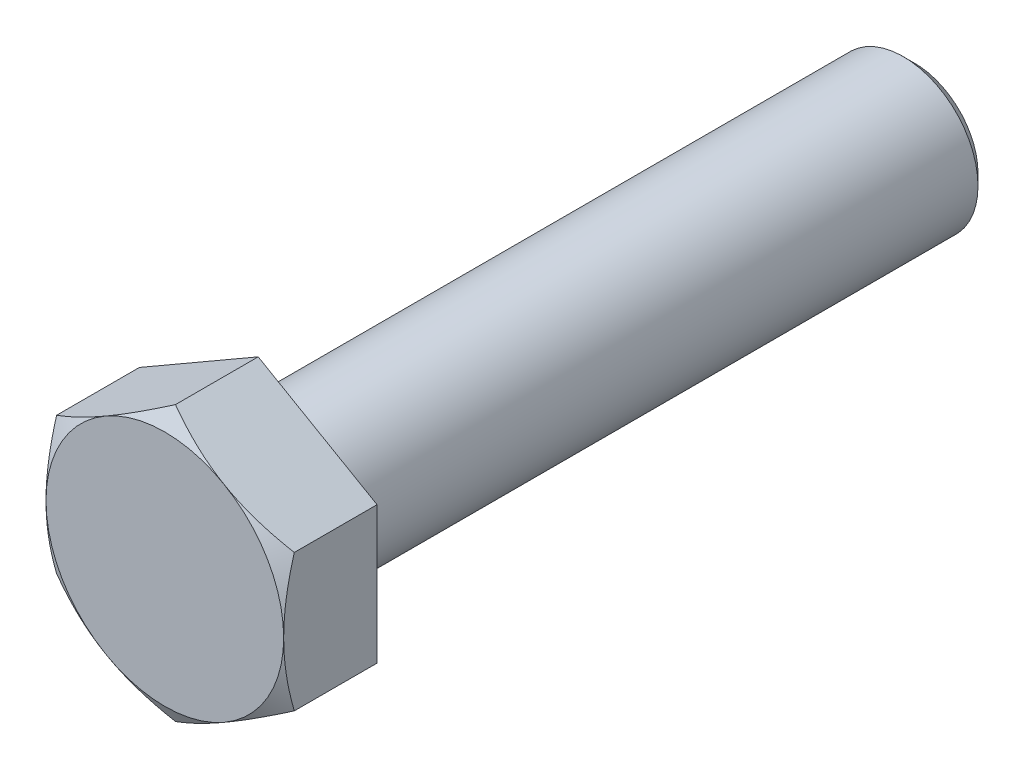
ISO-10303-21;
HEADER;
FILE_DESCRIPTION(('STEP AP214'),'2;1');
FILE_NAME('part.step','',(''),(''),'','','');
FILE_SCHEMA(('AUTOMOTIVE_DESIGN { 1 0 10303 214 1 1 1 1 }'));
ENDSEC;
DATA;
#1=APPLICATION_CONTEXT('core data for automotive mechanical design processes');
#2=APPLICATION_PROTOCOL_DEFINITION('international standard','automotive_design',2000,#1);
#3=PRODUCT_CONTEXT('',#1,'mechanical');
#4=PRODUCT('Part','Part','',(#3));
#5=PRODUCT_RELATED_PRODUCT_CATEGORY('part','',(#4));
#6=PRODUCT_DEFINITION_FORMATION('','',#4);
#7=PRODUCT_DEFINITION_CONTEXT('part definition',#1,'design');
#8=PRODUCT_DEFINITION('design','',#6,#7);
#9=PRODUCT_DEFINITION_SHAPE('','',#8);
#10=(LENGTH_UNIT() NAMED_UNIT(*) SI_UNIT(.MILLI.,.METRE.));
#11=(NAMED_UNIT(*) PLANE_ANGLE_UNIT() SI_UNIT($,.RADIAN.));
#12=(NAMED_UNIT(*) SI_UNIT($,.STERADIAN.) SOLID_ANGLE_UNIT());
#13=UNCERTAINTY_MEASURE_WITH_UNIT(LENGTH_MEASURE(1.E-05),#10,'distance_accuracy_value','');
#14=(GEOMETRIC_REPRESENTATION_CONTEXT(3) GLOBAL_UNCERTAINTY_ASSIGNED_CONTEXT((#13)) GLOBAL_UNIT_ASSIGNED_CONTEXT((#10,
#11,#12)) REPRESENTATION_CONTEXT('',''));
#15=CARTESIAN_POINT('',(0.,0.,0.));
#16=DIRECTION('',(0.,0.,1.));
#17=DIRECTION('',(1.,0.,0.));
#18=AXIS2_PLACEMENT_3D('',#15,#16,#17);
#19=CARTESIAN_POINT('',(0.,0.,0.));
#20=DIRECTION('',(0.,0.,1.));
#21=DIRECTION('',(1.,0.,0.));
#22=AXIS2_PLACEMENT_3D('',#19,#20,#21);
#23=PLANE('',#22);
#24=CARTESIAN_POINT('',(0.,0.,0.));
#25=DIRECTION('',(0.,0.,1.));
#26=DIRECTION('',(1.,0.,0.));
#27=AXIS2_PLACEMENT_3D('',#24,#25,#26);
#28=CIRCLE('',#27,4.6);
#29=CARTESIAN_POINT('',(4.6,0.,0.));
#30=VERTEX_POINT('',#29);
#31=EDGE_CURVE('E148',#30,#30,#28,.T.);
#32=ORIENTED_EDGE('',*,*,#31,.T.);
#33=EDGE_LOOP('',(#32));
#34=FACE_BOUND('',#33,.T.);
#35=CARTESIAN_POINT('',(0.,0.,0.));
#36=DIRECTION('',(0.,0.,1.));
#37=DIRECTION('',(1.,0.,0.));
#38=AXIS2_PLACEMENT_3D('',#35,#36,#37);
#39=CIRCLE('',#38,5.8);
#40=CARTESIAN_POINT('',(5.8,0.,0.));
#41=VERTEX_POINT('',#40);
#42=EDGE_CURVE('E294',#41,#41,#39,.T.);
#43=ORIENTED_EDGE('',*,*,#42,.F.);
#44=EDGE_LOOP('',(#43));
#45=FACE_BOUND('',#44,.T.);
#46=ADVANCED_FACE('F39',(#34,#45),#23,.F.);
#47=CARTESIAN_POINT('',(0.,0.,-0.6));
#48=DIRECTION('',(0.,0.,1.));
#49=DIRECTION('',(1.,0.,0.));
#50=AXIS2_PLACEMENT_3D('',#47,#48,#49);
#51=TOROIDAL_SURFACE('',#50,4.6,0.600000000000001);
#52=ORIENTED_EDGE('',*,*,#31,.F.);
#53=EDGE_LOOP('',(#52));
#54=FACE_BOUND('',#53,.T.);
#55=CARTESIAN_POINT('',(0.,0.,-0.6));
#56=DIRECTION('',(0.,0.,1.));
#57=DIRECTION('',(1.,0.,0.));
#58=AXIS2_PLACEMENT_3D('',#55,#56,#57);
#59=CIRCLE('',#58,4.);
#60=CARTESIAN_POINT('',(4.,0.,-0.6));
#61=VERTEX_POINT('',#60);
#62=EDGE_CURVE('E151',#61,#61,#59,.T.);
#63=ORIENTED_EDGE('',*,*,#62,.T.);
#64=EDGE_LOOP('',(#63));
#65=FACE_BOUND('',#64,.T.);
#66=ADVANCED_FACE('F235',(#54,#65),#51,.F.);
#67=CARTESIAN_POINT('',(0.,0.,0.));
#68=DIRECTION('',(0.,0.,1.));
#69=DIRECTION('',(1.,0.,0.));
#70=AXIS2_PLACEMENT_3D('',#67,#68,#69);
#71=CYLINDRICAL_SURFACE('',#70,4.);
#72=ORIENTED_EDGE('',*,*,#62,.F.);
#73=EDGE_LOOP('',(#72));
#74=FACE_BOUND('',#73,.T.);
#75=CARTESIAN_POINT('',(0.,0.,-34.4));
#76=DIRECTION('',(0.,0.,1.));
#77=DIRECTION('',(1.,0.,0.));
#78=AXIS2_PLACEMENT_3D('',#75,#76,#77);
#79=CIRCLE('',#78,4.);
#80=CARTESIAN_POINT('',(4.,0.,-34.4));
#81=VERTEX_POINT('',#80);
#82=EDGE_CURVE('E154',#81,#81,#79,.T.);
#83=ORIENTED_EDGE('',*,*,#82,.T.);
#84=EDGE_LOOP('',(#83));
#85=FACE_BOUND('',#84,.T.);
#86=ADVANCED_FACE('F241',(#74,#85),#71,.T.);
#87=CARTESIAN_POINT('',(0.,0.,-35.));
#88=DIRECTION('',(0.,0.,1.));
#89=DIRECTION('',(1.,0.,0.));
#90=AXIS2_PLACEMENT_3D('',#87,#88,#89);
#91=CONICAL_SURFACE('',#90,3.4,0.785398163397446);
#92=ORIENTED_EDGE('',*,*,#82,.F.);
#93=EDGE_LOOP('',(#92));
#94=FACE_BOUND('',#93,.T.);
#95=CARTESIAN_POINT('',(0.,0.,-35.));
#96=DIRECTION('',(0.,0.,1.));
#97=DIRECTION('',(1.,0.,0.));
#98=AXIS2_PLACEMENT_3D('',#95,#96,#97);
#99=CIRCLE('',#98,3.4);
#100=CARTESIAN_POINT('',(3.4,0.,-35.));
#101=VERTEX_POINT('',#100);
#102=EDGE_CURVE('E127',#101,#101,#99,.T.);
#103=ORIENTED_EDGE('',*,*,#102,.T.);
#104=EDGE_LOOP('',(#103));
#105=FACE_BOUND('',#104,.T.);
#106=ADVANCED_FACE('F308',(#94,#105),#91,.T.);
#107=CARTESIAN_POINT('',(0.,3.4,-35.));
#108=DIRECTION('',(0.,0.,1.));
#109=DIRECTION('',(1.,0.,0.));
#110=AXIS2_PLACEMENT_3D('',#107,#108,#109);
#111=PLANE('',#110);
#112=ORIENTED_EDGE('',*,*,#102,.F.);
#113=EDGE_LOOP('',(#112));
#114=FACE_BOUND('',#113,.T.);
#115=ADVANCED_FACE('F304',(#114),#111,.F.);
#116=CARTESIAN_POINT('',(0.,7.34966892678394,0.150000000000001));
#117=DIRECTION('',(0.,0.,-1.));
#118=DIRECTION('',(-1.,0.,0.));
#119=AXIS2_PLACEMENT_3D('',#116,#117,#118);
#120=PLANE('',#119);
#121=CARTESIAN_POINT('',(0.,0.,0.150000000000001));
#122=DIRECTION('',(0.,0.,1.));
#123=DIRECTION('',(1.,0.,0.));
#124=AXIS2_PLACEMENT_3D('',#121,#122,#123);
#125=CIRCLE('',#124,5.88660254037844);
#126=CARTESIAN_POINT('',(5.88660254037844,0.,0.150000000000001));
#127=VERTEX_POINT('',#126);
#128=EDGE_CURVE('E291',#127,#127,#125,.T.);
#129=ORIENTED_EDGE('',*,*,#128,.T.);
#130=EDGE_LOOP('',(#129));
#131=FACE_BOUND('',#130,.T.);
#132=DIRECTION('',(0.866025403784439,-0.5,0.));
#133=VECTOR('',#132,1.);
#134=CARTESIAN_POINT('',(6.365,3.67483446339197,0.150000000000001));
#135=LINE('',#134,#133);
#136=CARTESIAN_POINT('',(0.,7.34966892678394,0.150000000000001));
#137=VERTEX_POINT('',#136);
#138=CARTESIAN_POINT('',(6.365,3.67483446339197,0.150000000000003));
#139=VERTEX_POINT('',#138);
#140=EDGE_CURVE('E62',#137,#139,#135,.T.);
#141=ORIENTED_EDGE('',*,*,#140,.T.);
#142=DIRECTION('',(0.,-1.,0.));
#143=VECTOR('',#142,1.);
#144=CARTESIAN_POINT('',(6.365,-3.67483446339197,0.150000000000001));
#145=LINE('',#144,#143);
#146=CARTESIAN_POINT('',(6.365,-3.67483446339197,0.150000000000001));
#147=VERTEX_POINT('',#146);
#148=EDGE_CURVE('E11',#139,#147,#145,.T.);
#149=ORIENTED_EDGE('',*,*,#148,.T.);
#150=DIRECTION('',(-0.866025403784439,-0.5,0.));
#151=VECTOR('',#150,1.);
#152=CARTESIAN_POINT('',(0.,-7.34966892678394,0.150000000000001));
#153=LINE('',#152,#151);
#154=CARTESIAN_POINT('',(0.,-7.34966892678394,0.150000000000001));
#155=VERTEX_POINT('',#154);
#156=EDGE_CURVE('E162',#147,#155,#153,.T.);
#157=ORIENTED_EDGE('',*,*,#156,.T.);
#158=DIRECTION('',(-0.866025403784438,0.5,0.));
#159=VECTOR('',#158,1.);
#160=CARTESIAN_POINT('',(-6.365,-3.67483446339197,0.150000000000001));
#161=LINE('',#160,#159);
#162=CARTESIAN_POINT('',(-6.365,-3.67483446339197,0.150000000000001));
#163=VERTEX_POINT('',#162);
#164=EDGE_CURVE('E160',#155,#163,#161,.T.);
#165=ORIENTED_EDGE('',*,*,#164,.T.);
#166=DIRECTION('',(0.,1.,0.));
#167=VECTOR('',#166,1.);
#168=CARTESIAN_POINT('',(-6.365,3.67483446339197,0.150000000000001));
#169=LINE('',#168,#167);
#170=CARTESIAN_POINT('',(-6.365,3.67483446339197,0.150000000000001));
#171=VERTEX_POINT('',#170);
#172=EDGE_CURVE('E113',#163,#171,#169,.T.);
#173=ORIENTED_EDGE('',*,*,#172,.T.);
#174=DIRECTION('',(0.866025403784439,0.5,0.));
#175=VECTOR('',#174,1.);
#176=CARTESIAN_POINT('',(0.,7.34966892678394,0.150000000000001));
#177=LINE('',#176,#175);
#178=EDGE_CURVE('E110',#171,#137,#177,.T.);
#179=ORIENTED_EDGE('',*,*,#178,.T.);
#180=EDGE_LOOP('',(#141,#149,#157,#165,#173,#179));
#181=FACE_BOUND('',#180,.T.);
#182=ADVANCED_FACE('F111',(#131,#181),#120,.T.);
#183=CARTESIAN_POINT('',(0.,0.,0.150000000000001));
#184=DIRECTION('',(0.,0.,1.));
#185=DIRECTION('',(1.,0.,0.));
#186=AXIS2_PLACEMENT_3D('',#183,#184,#185);
#187=CONICAL_SURFACE('',#186,5.88660254037844,0.523598775598302);
#188=ORIENTED_EDGE('',*,*,#42,.T.);
#189=EDGE_LOOP('',(#188));
#190=FACE_BOUND('',#189,.T.);
#191=ORIENTED_EDGE('',*,*,#128,.F.);
#192=EDGE_LOOP('',(#191));
#193=FACE_BOUND('',#192,.T.);
#194=ADVANCED_FACE('F186',(#190,#193),#187,.T.);
#195=CARTESIAN_POINT('',(6.365,-3.67483446339197,5.15));
#196=DIRECTION('',(-1.,0.,0.));
#197=DIRECTION('',(0.,0.,1.));
#198=AXIS2_PLACEMENT_3D('',#195,#196,#197);
#199=PLANE('',#198);
#200=CARTESIAN_POINT('',(6.365,-9.74620255402201,2.10417752070094));
#201=CARTESIAN_POINT('',(6.365,-9.466743061924,2.23922778450705));
#202=CARTESIAN_POINT('',(6.365,-9.18662283336427,2.37293553637398));
#203=CARTESIAN_POINT('',(6.365,-8.62470364838083,2.63689885997667));
#204=CARTESIAN_POINT('',(6.365,-8.34290441151386,2.76715383400583));
#205=CARTESIAN_POINT('',(6.365,-7.77574769826275,3.02413063602513));
#206=CARTESIAN_POINT('',(6.365,-7.49037908790233,3.15082797964364));
#207=CARTESIAN_POINT('',(6.365,-6.91729637209056,3.39878070466244));
#208=CARTESIAN_POINT('',(6.365,-6.62958238982508,3.52003636972724));
#209=CARTESIAN_POINT('',(6.365,-6.04777966328442,3.75709828240193));
#210=CARTESIAN_POINT('',(6.365,-5.75365602159666,3.87281935215871));
#211=CARTESIAN_POINT('',(6.365,-5.16193930006325,4.09519817931673));
#212=CARTESIAN_POINT('',(6.365,-4.864345838395,4.20185492835972));
#213=CARTESIAN_POINT('',(6.365,-4.26582830474239,4.40323957299992));
#214=CARTESIAN_POINT('',(6.365,-3.96491285237291,4.49799282927845));
#215=CARTESIAN_POINT('',(6.365,-3.35880092538506,4.67249210660028));
#216=CARTESIAN_POINT('',(6.365,-3.05360583750632,4.75224287346636));
#217=CARTESIAN_POINT('',(6.365,-2.43874088628671,4.89286958916527));
#218=CARTESIAN_POINT('',(6.365,-2.12906985440494,4.95374051233359));
#219=CARTESIAN_POINT('',(6.365,-1.50595084883236,5.05249385747353));
#220=CARTESIAN_POINT('',(6.365,-1.19250287180248,5.0903762591204));
#221=CARTESIAN_POINT('',(6.365,-0.721832091587364,5.12753002038573));
#222=CARTESIAN_POINT('',(6.365,-0.565346043942451,5.13663818585123));
#223=CARTESIAN_POINT('',(6.365,-0.252121475645645,5.14822358924696));
#224=CARTESIAN_POINT('',(6.365,-0.0953829582988819,5.15070091328813));
#225=CARTESIAN_POINT('',(6.365,0.218011475278279,5.14895808707227));
#226=CARTESIAN_POINT('',(6.365,0.374667402345121,5.14473981644265));
#227=CARTESIAN_POINT('',(6.365,0.687665429465812,5.12971270573269));
#228=CARTESIAN_POINT('',(6.365,0.844007513456339,5.11890353652779));
#229=CARTESIAN_POINT('',(6.365,1.22293245370947,5.08494297431608));
#230=CARTESIAN_POINT('',(6.365,1.445224118384,5.05848904503914));
#231=CARTESIAN_POINT('',(6.365,1.88810410746324,4.99372467120738));
#232=CARTESIAN_POINT('',(6.365,2.10869195007896,4.95541099043317));
#233=CARTESIAN_POINT('',(6.365,2.547982235728,4.86828591240334));
#234=CARTESIAN_POINT('',(6.365,2.76668269133519,4.81946458949066));
#235=CARTESIAN_POINT('',(6.365,3.20183348991462,4.71281384098773));
#236=CARTESIAN_POINT('',(6.365,3.4182840428113,4.65498526400403));
#237=CARTESIAN_POINT('',(6.365,3.85426615972079,4.53019185361869));
#238=CARTESIAN_POINT('',(6.365,4.07374319251582,4.46303781689891));
#239=CARTESIAN_POINT('',(6.365,4.51037738064171,4.32209453671705));
#240=CARTESIAN_POINT('',(6.365,4.72753602208682,4.24830986982301));
#241=CARTESIAN_POINT('',(6.365,5.15866204869267,4.09562942366593));
#242=CARTESIAN_POINT('',(6.365,5.37264051637927,4.01676475081889));
#243=CARTESIAN_POINT('',(6.365,5.79893727559048,3.85440649793558));
#244=CARTESIAN_POINT('',(6.365,6.01125485600018,3.77091104705295));
#245=CARTESIAN_POINT('',(6.365,6.22280111012558,3.68555829334041));
#246=B_SPLINE_CURVE_WITH_KNOTS('',3,(#200,#201,#202,#203,#204,#205,#206,#207,#208,#209,#210,
#211,#212,#213,#214,#215,#216,#217,#218,#219,#220,#221,#222,#223,#224,#225,#226,#227,#228,#229,
#230,#231,#232,#233,#234,#235,#236,#237,#238,#239,#240,#241,#242,#243,#244,#245),.UNSPECIFIED.,
.F.,.F.,(4,2,2,2,2,2,2,2,2,2,2,2,2,2,2,2,2,2,2,2,2,2,4),(0.,0.931154614866976,1.86246938194105,
2.79911368730425,3.73570911030725,4.68380301837242,5.63200225923999,6.57814578450031,
7.52398950564165,8.47008478721693,9.41618090525813,9.88631422449017,10.3564414383406,
10.8264366986048,11.2964554305782,11.9676621628092,12.6390522116941,13.3110792699478,
13.9830430523123,14.6714781192221,15.3594416141426,16.0435327883289,16.7279023793783),.UNSPECIFIED.);
#247=CARTESIAN_POINT('',(6.365,-3.67483446339197,4.58150113005864));
#248=VERTEX_POINT('',#247);
#249=CARTESIAN_POINT('',(6.365,0.,5.15));
#250=VERTEX_POINT('',#249);
#251=EDGE_CURVE('E289',#248,#250,#246,.T.);
#252=ORIENTED_EDGE('',*,*,#251,.F.);
#253=DIRECTION('',(0.,0.,-1.));
#254=VECTOR('',#253,1.);
#255=CARTESIAN_POINT('',(6.365,-3.67483446339197,5.15));
#256=LINE('',#255,#254);
#257=EDGE_CURVE('E144',#248,#147,#256,.T.);
#258=ORIENTED_EDGE('',*,*,#257,.T.);
#259=ORIENTED_EDGE('',*,*,#148,.F.);
#260=DIRECTION('',(0.,0.,-1.));
#261=VECTOR('',#260,1.);
#262=CARTESIAN_POINT('',(6.365,3.67483446339197,5.15));
#263=LINE('',#262,#261);
#264=CARTESIAN_POINT('',(6.365,3.67483446339197,4.58150113005864));
#265=VERTEX_POINT('',#264);
#266=EDGE_CURVE('E126',#265,#139,#263,.T.);
#267=ORIENTED_EDGE('',*,*,#266,.F.);
#268=EDGE_CURVE('E191',#250,#265,#246,.T.);
#269=ORIENTED_EDGE('',*,*,#268,.F.);
#270=EDGE_LOOP('',(#252,#258,#259,#267,#269));
#271=FACE_BOUND('',#270,.T.);
#272=ADVANCED_FACE('F246',(#271),#199,.F.);
#273=CARTESIAN_POINT('',(0.,-7.34966892678394,5.15));
#274=DIRECTION('',(-0.5,0.866025403784439,0.));
#275=DIRECTION('',(-0.866025403784439,-0.5,0.));
#276=AXIS2_PLACEMENT_3D('',#273,#274,#275);
#277=PLANE('',#276);
#278=CARTESIAN_POINT('',(-0.000200000000001205,-7.34978439683778,4.58143446182091));
#279=CARTESIAN_POINT('',(0.139710039115643,-7.26900729809203,4.6280643413956));
#280=CARTESIAN_POINT('',(0.280141730709852,-7.18792902314736,4.67257800061253));
#281=CARTESIAN_POINT('',(0.562145571657772,-7.02511402966357,4.75679002639063));
#282=CARTESIAN_POINT('',(0.703718185116129,-6.94337704317351,4.79648631569877));
#283=CARTESIAN_POINT('',(1.13070279037378,-6.69685736638818,4.90756995845888));
#284=CARTESIAN_POINT('',(1.41780023937635,-6.53110157692289,4.97075318530501));
#285=CARTESIAN_POINT('',(1.84743635075536,-6.28305105236463,5.04484317711931));
#286=CARTESIAN_POINT('',(1.9886912977997,-6.20149747066421,5.0659493132145));
#287=CARTESIAN_POINT('',(2.27183945542866,-6.03802180563659,5.10134132834389));
#288=CARTESIAN_POINT('',(2.41373260850058,-5.95609975551435,5.11562780998361));
#289=CARTESIAN_POINT('',(2.6977653589495,-5.792113370584,5.13701642089907));
#290=CARTESIAN_POINT('',(2.83990449241902,-5.71004930361299,5.1441267036469));
#291=CARTESIAN_POINT('',(3.12430622079744,-5.54584988917571,5.15101808099618));
#292=CARTESIAN_POINT('',(3.26656881175663,-5.46371454398981,5.15079940200902));
#293=CARTESIAN_POINT('',(3.65632359139324,-5.23868951704867,5.14012613527418));
#294=CARTESIAN_POINT('',(3.90368820112705,-5.09587349303087,5.1222078418454));
#295=CARTESIAN_POINT('',(4.39677444253791,-4.81119001881861,5.06538838058255));
#296=CARTESIAN_POINT('',(4.64249434006573,-4.66932356983568,5.02646779156689));
#297=CARTESIAN_POINT('',(5.13657294389504,-4.38406715491399,4.92917745645478));
#298=CARTESIAN_POINT('',(5.38486930573046,-4.24071318356951,4.87039549497283));
#299=CARTESIAN_POINT('',(5.87775919646686,-3.956143072472,4.73698409890944));
#300=CARTESIAN_POINT('',(6.12235903782157,-3.81492328822212,4.66238600278679));
#301=CARTESIAN_POINT('',(6.3652,-3.67471899333814,4.58143446182091));
#302=B_SPLINE_CURVE_WITH_KNOTS('',3,(#278,#279,#280,#281,#282,#283,#284,#285,#286,#287,#288,
#289,#290,#291,#292,#293,#294,#295,#296,#297,#298,#299,#300,#301),.UNSPECIFIED.,.F.,.F.,(4,2,2,
2,2,2,2,2,2,2,2,4),(0.,0.504406880784759,1.00903049509045,2.02037460639605,2.51366063649745,
3.00690307026488,3.49958445754648,3.99225062458519,4.84993121388198,5.70840627760013,
6.58592135712847,7.46171369114761),.UNSPECIFIED.);
#303=CARTESIAN_POINT('',(0.,-7.34966892678394,4.58150113005864));
#304=VERTEX_POINT('',#303);
#305=CARTESIAN_POINT('',(3.1825,-5.51225169508795,5.15));
#306=VERTEX_POINT('',#305);
#307=EDGE_CURVE('E260',#304,#306,#302,.T.);
#308=ORIENTED_EDGE('',*,*,#307,.F.);
#309=DIRECTION('',(0.,0.,-1.));
#310=VECTOR('',#309,1.);
#311=CARTESIAN_POINT('',(0.,-7.34966892678394,5.15));
#312=LINE('',#311,#310);
#313=EDGE_CURVE('E141',#304,#155,#312,.T.);
#314=ORIENTED_EDGE('',*,*,#313,.T.);
#315=ORIENTED_EDGE('',*,*,#156,.F.);
#316=ORIENTED_EDGE('',*,*,#257,.F.);
#317=EDGE_CURVE('E201',#306,#248,#302,.T.);
#318=ORIENTED_EDGE('',*,*,#317,.F.);
#319=EDGE_LOOP('',(#308,#314,#315,#316,#318));
#320=FACE_BOUND('',#319,.T.);
#321=ADVANCED_FACE('F249',(#320),#277,.F.);
#322=CARTESIAN_POINT('',(-6.365,-3.67483446339197,5.15));
#323=DIRECTION('',(0.5,0.866025403784439,0.));
#324=DIRECTION('',(-0.866025403784438,0.5,0.));
#325=AXIS2_PLACEMENT_3D('',#322,#323,#324);
#326=PLANE('',#325);
#327=CARTESIAN_POINT('',(-6.3652,-3.67471899333813,4.58143446182091));
#328=CARTESIAN_POINT('',(-6.22528996088436,-3.75549609208388,4.6280643413956));
#329=CARTESIAN_POINT('',(-6.08485826929015,-3.83657436702855,4.67257800061253));
#330=CARTESIAN_POINT('',(-5.80285442834223,-3.99938936051234,4.75679002639063));
#331=CARTESIAN_POINT('',(-5.66128181488387,-4.0811263470024,4.79648631569877));
#332=CARTESIAN_POINT('',(-5.23429720962622,-4.32764602378773,4.90756995845888));
#333=CARTESIAN_POINT('',(-4.94719976062365,-4.49340181325302,4.97075318530501));
#334=CARTESIAN_POINT('',(-4.51756364924464,-4.74145233781128,5.04484317711931));
#335=CARTESIAN_POINT('',(-4.3763087022003,-4.82300591951169,5.0659493132145));
#336=CARTESIAN_POINT('',(-4.09316054457134,-4.98648158453932,5.10134132834389));
#337=CARTESIAN_POINT('',(-3.95126739149942,-5.06840363466156,5.11562780998361));
#338=CARTESIAN_POINT('',(-3.6672346410505,-5.23239001959191,5.13701642089907));
#339=CARTESIAN_POINT('',(-3.52509550758098,-5.31445408656292,5.1441267036469));
#340=CARTESIAN_POINT('',(-3.24069377920256,-5.47865350100019,5.15101808099618));
#341=CARTESIAN_POINT('',(-3.09843118824337,-5.5607888461861,5.15079940200902));
#342=CARTESIAN_POINT('',(-2.70867640860676,-5.78581387312724,5.14012613527418));
#343=CARTESIAN_POINT('',(-2.46131179887295,-5.92862989714504,5.1222078418454));
#344=CARTESIAN_POINT('',(-1.96822555746209,-6.2133133713573,5.06538838058255));
#345=CARTESIAN_POINT('',(-1.72250565993427,-6.35517982034023,5.02646779156689));
#346=CARTESIAN_POINT('',(-1.22842705610496,-6.64043623526192,4.92917745645478));
#347=CARTESIAN_POINT('',(-0.980130694269542,-6.78379020660641,4.87039549497283));
#348=CARTESIAN_POINT('',(-0.487240803533137,-7.06836031770391,4.73698409890944));
#349=CARTESIAN_POINT('',(-0.242640962178432,-7.20958010195379,4.66238600278679));
#350=CARTESIAN_POINT('',(0.000199999999998262,-7.34978439683778,4.58143446182091));
#351=B_SPLINE_CURVE_WITH_KNOTS('',3,(#327,#328,#329,#330,#331,#332,#333,#334,#335,#336,#337,
#338,#339,#340,#341,#342,#343,#344,#345,#346,#347,#348,#349,#350),.UNSPECIFIED.,.F.,.F.,(4,2,2,
2,2,2,2,2,2,2,2,4),(0.,0.504406880784758,1.00903049509045,2.02037460639605,2.51366063649744,
3.00690307026488,3.49958445754648,3.99225062458519,4.84993121388198,5.70840627760013,
6.58592135712847,7.46171369114762),.UNSPECIFIED.);
#352=CARTESIAN_POINT('',(-6.365,-3.67483446339197,4.58150113005864));
#353=VERTEX_POINT('',#352);
#354=CARTESIAN_POINT('',(-3.1825,-5.51225169508795,5.15));
#355=VERTEX_POINT('',#354);
#356=EDGE_CURVE('E222',#353,#355,#351,.T.);
#357=ORIENTED_EDGE('',*,*,#356,.F.);
#358=DIRECTION('',(0.,0.,-1.));
#359=VECTOR('',#358,1.);
#360=CARTESIAN_POINT('',(-6.365,-3.67483446339197,5.15));
#361=LINE('',#360,#359);
#362=EDGE_CURVE('E136',#353,#163,#361,.T.);
#363=ORIENTED_EDGE('',*,*,#362,.T.);
#364=ORIENTED_EDGE('',*,*,#164,.F.);
#365=ORIENTED_EDGE('',*,*,#313,.F.);
#366=EDGE_CURVE('E209',#355,#304,#351,.T.);
#367=ORIENTED_EDGE('',*,*,#366,.F.);
#368=EDGE_LOOP('',(#357,#363,#364,#365,#367));
#369=FACE_BOUND('',#368,.T.);
#370=ADVANCED_FACE('F226',(#369),#326,.F.);
#371=CARTESIAN_POINT('',(-6.365,3.67483446339197,5.15));
#372=DIRECTION('',(1.,0.,0.));
#373=DIRECTION('',(0.,0.,-1.));
#374=AXIS2_PLACEMENT_3D('',#371,#372,#373);
#375=PLANE('',#374);
#376=CARTESIAN_POINT('',(-6.365,-9.74620255402201,2.10417752070094));
#377=CARTESIAN_POINT('',(-6.365,-9.466743061924,2.23922778450705));
#378=CARTESIAN_POINT('',(-6.365,-9.18662283336426,2.37293553637398));
#379=CARTESIAN_POINT('',(-6.365,-8.62470364838082,2.63689885997667));
#380=CARTESIAN_POINT('',(-6.365,-8.34290441151386,2.76715383400583));
#381=CARTESIAN_POINT('',(-6.365,-7.77574769826275,3.02413063602514));
#382=CARTESIAN_POINT('',(-6.365,-7.49037908790233,3.15082797964364));
#383=CARTESIAN_POINT('',(-6.365,-6.91729637209055,3.39878070466244));
#384=CARTESIAN_POINT('',(-6.365,-6.62958238982508,3.52003636972724));
#385=CARTESIAN_POINT('',(-6.365,-6.04777966328442,3.75709828240193));
#386=CARTESIAN_POINT('',(-6.365,-5.75365602159666,3.87281935215871));
#387=CARTESIAN_POINT('',(-6.365,-5.16193930006325,4.09519817931673));
#388=CARTESIAN_POINT('',(-6.365,-4.864345838395,4.20185492835972));
#389=CARTESIAN_POINT('',(-6.365,-4.26582830474239,4.40323957299992));
#390=CARTESIAN_POINT('',(-6.365,-3.96491285237291,4.49799282927845));
#391=CARTESIAN_POINT('',(-6.365,-3.35880092538506,4.67249210660028));
#392=CARTESIAN_POINT('',(-6.365,-3.05360583750632,4.75224287346636));
#393=CARTESIAN_POINT('',(-6.365,-2.4387408862867,4.89286958916527));
#394=CARTESIAN_POINT('',(-6.365,-2.12906985440494,4.95374051233359));
#395=CARTESIAN_POINT('',(-6.365,-1.50595084883235,5.05249385747353));
#396=CARTESIAN_POINT('',(-6.365,-1.19250287180248,5.0903762591204));
#397=CARTESIAN_POINT('',(-6.365,-0.72183209158736,5.12753002038573));
#398=CARTESIAN_POINT('',(-6.365,-0.565346043942447,5.13663818585123));
#399=CARTESIAN_POINT('',(-6.365,-0.252121475645641,5.14822358924696));
#400=CARTESIAN_POINT('',(-6.365,-0.0953829582988774,5.15070091328813));
#401=CARTESIAN_POINT('',(-6.365,0.218011475278284,5.14895808707227));
#402=CARTESIAN_POINT('',(-6.365,0.374667402345125,5.14473981644265));
#403=CARTESIAN_POINT('',(-6.365,0.687665429465816,5.12971270573269));
#404=CARTESIAN_POINT('',(-6.365,0.844007513456343,5.11890353652778));
#405=CARTESIAN_POINT('',(-6.365,1.22293245370947,5.08494297431608));
#406=CARTESIAN_POINT('',(-6.365,1.445224118384,5.05848904503914));
#407=CARTESIAN_POINT('',(-6.365,1.88810410746324,4.99372467120738));
#408=CARTESIAN_POINT('',(-6.365,2.10869195007897,4.95541099043317));
#409=CARTESIAN_POINT('',(-6.365,2.547982235728,4.86828591240333));
#410=CARTESIAN_POINT('',(-6.365,2.76668269133519,4.81946458949066));
#411=CARTESIAN_POINT('',(-6.365,3.20183348991463,4.71281384098773));
#412=CARTESIAN_POINT('',(-6.365,3.4182840428113,4.65498526400403));
#413=CARTESIAN_POINT('',(-6.365,3.85426615972079,4.53019185361869));
#414=CARTESIAN_POINT('',(-6.365,4.07374319251583,4.46303781689891));
#415=CARTESIAN_POINT('',(-6.365,4.51037738064171,4.32209453671705));
#416=CARTESIAN_POINT('',(-6.365,4.72753602208683,4.24830986982301));
#417=CARTESIAN_POINT('',(-6.365,5.15866204869268,4.09562942366593));
#418=CARTESIAN_POINT('',(-6.365,5.37264051637928,4.01676475081889));
#419=CARTESIAN_POINT('',(-6.365,5.79893727559049,3.85440649793558));
#420=CARTESIAN_POINT('',(-6.365,6.01125485600019,3.77091104705294));
#421=CARTESIAN_POINT('',(-6.365,6.22280111012559,3.6855582933404));
#422=B_SPLINE_CURVE_WITH_KNOTS('',3,(#376,#377,#378,#379,#380,#381,#382,#383,#384,#385,#386,
#387,#388,#389,#390,#391,#392,#393,#394,#395,#396,#397,#398,#399,#400,#401,#402,#403,#404,#405,
#406,#407,#408,#409,#410,#411,#412,#413,#414,#415,#416,#417,#418,#419,#420,#421),.UNSPECIFIED.,
.F.,.F.,(4,2,2,2,2,2,2,2,2,2,2,2,2,2,2,2,2,2,2,2,2,2,4),(0.,0.931154614866975,1.86246938194105,
2.79911368730425,3.73570911030724,4.68380301837242,5.63200225923999,6.57814578450031,
7.52398950564165,8.47008478721693,9.41618090525813,9.88631422449017,10.3564414383406,
10.8264366986048,11.2964554305782,11.9676621628092,12.6390522116941,13.3110792699478,
13.9830430523123,14.6714781192221,15.3594416141426,16.0435327883289,16.7279023793783),.UNSPECIFIED.);
#423=CARTESIAN_POINT('',(-6.365,3.67483446339197,4.58150113005864));
#424=VERTEX_POINT('',#423);
#425=CARTESIAN_POINT('',(-6.365,0.,5.15));
#426=VERTEX_POINT('',#425);
#427=EDGE_CURVE('E221',#424,#426,#422,.F.);
#428=ORIENTED_EDGE('',*,*,#427,.F.);
#429=DIRECTION('',(0.,0.,-1.));
#430=VECTOR('',#429,1.);
#431=CARTESIAN_POINT('',(-6.365,3.67483446339197,5.15));
#432=LINE('',#431,#430);
#433=EDGE_CURVE('E133',#424,#171,#432,.T.);
#434=ORIENTED_EDGE('',*,*,#433,.T.);
#435=ORIENTED_EDGE('',*,*,#172,.F.);
#436=ORIENTED_EDGE('',*,*,#362,.F.);
#437=EDGE_CURVE('E215',#426,#353,#422,.F.);
#438=ORIENTED_EDGE('',*,*,#437,.F.);
#439=EDGE_LOOP('',(#428,#434,#435,#436,#438));
#440=FACE_BOUND('',#439,.T.);
#441=ADVANCED_FACE('F223',(#440),#375,.F.);
#442=CARTESIAN_POINT('',(0.,7.34966892678394,5.15));
#443=DIRECTION('',(0.5,-0.866025403784439,0.));
#444=DIRECTION('',(0.866025403784439,0.5,0.));
#445=AXIS2_PLACEMENT_3D('',#442,#443,#444);
#446=PLANE('',#445);
#447=CARTESIAN_POINT('',(0.000200000000001834,7.34978439683777,4.58143446182091));
#448=CARTESIAN_POINT('',(-0.139710039115642,7.26900729809203,4.6280643413956));
#449=CARTESIAN_POINT('',(-0.280141730709851,7.18792902314735,4.67257800061253));
#450=CARTESIAN_POINT('',(-0.562145571657771,7.02511402966357,4.75679002639063));
#451=CARTESIAN_POINT('',(-0.703718185116128,6.9433770431735,4.79648631569878));
#452=CARTESIAN_POINT('',(-1.13070279037378,6.69685736638817,4.90756995845888));
#453=CARTESIAN_POINT('',(-1.41780023937635,6.53110157692288,4.97075318530501));
#454=CARTESIAN_POINT('',(-1.84743635075535,6.28305105236463,5.04484317711932));
#455=CARTESIAN_POINT('',(-1.9886912977997,6.20149747066421,5.0659493132145));
#456=CARTESIAN_POINT('',(-2.27183945542866,6.03802180563659,5.10134132834389));
#457=CARTESIAN_POINT('',(-2.41373260850058,5.95609975551435,5.11562780998362));
#458=CARTESIAN_POINT('',(-2.69776535894949,5.792113370584,5.13701642089907));
#459=CARTESIAN_POINT('',(-2.83990449241902,5.71004930361299,5.14412670364691));
#460=CARTESIAN_POINT('',(-3.12430622079744,5.54584988917571,5.15101808099618));
#461=CARTESIAN_POINT('',(-3.26656881175663,5.46371454398981,5.15079940200902));
#462=CARTESIAN_POINT('',(-3.65632359139324,5.23868951704867,5.14012613527418));
#463=CARTESIAN_POINT('',(-3.90368820112705,5.09587349303087,5.1222078418454));
#464=CARTESIAN_POINT('',(-4.3967744425379,4.81119001881861,5.06538838058255));
#465=CARTESIAN_POINT('',(-4.64249434006573,4.66932356983568,5.0264677915669));
#466=CARTESIAN_POINT('',(-5.13657294389504,4.38406715491398,4.92917745645479));
#467=CARTESIAN_POINT('',(-5.38486930573046,4.2407131835695,4.87039549497283));
#468=CARTESIAN_POINT('',(-5.87775919646686,3.95614307247199,4.73698409890945));
#469=CARTESIAN_POINT('',(-6.12235903782157,3.81492328822211,4.66238600278679));
#470=CARTESIAN_POINT('',(-6.3652,3.67471899333813,4.58143446182091));
#471=B_SPLINE_CURVE_WITH_KNOTS('',3,(#447,#448,#449,#450,#451,#452,#453,#454,#455,#456,#457,
#458,#459,#460,#461,#462,#463,#464,#465,#466,#467,#468,#469,#470),.UNSPECIFIED.,.F.,.F.,(4,2,2,
2,2,2,2,2,2,2,2,4),(0.,0.504406880784759,1.00903049509045,2.02037460639605,2.51366063649744,
3.00690307026487,3.49958445754648,3.99225062458519,4.84993121388198,5.70840627760013,
6.58592135712847,7.46171369114762),.UNSPECIFIED.);
#472=CARTESIAN_POINT('',(0.,7.34966892678394,4.58150113005864));
#473=VERTEX_POINT('',#472);
#474=CARTESIAN_POINT('',(-3.1825,5.51225169508795,5.15));
#475=VERTEX_POINT('',#474);
#476=EDGE_CURVE('E132',#473,#475,#471,.T.);
#477=ORIENTED_EDGE('',*,*,#476,.F.);
#478=DIRECTION('',(0.,0.,-1.));
#479=VECTOR('',#478,1.);
#480=CARTESIAN_POINT('',(0.,7.34966892678394,5.15));
#481=LINE('',#480,#479);
#482=EDGE_CURVE('E124',#473,#137,#481,.T.);
#483=ORIENTED_EDGE('',*,*,#482,.T.);
#484=ORIENTED_EDGE('',*,*,#178,.F.);
#485=ORIENTED_EDGE('',*,*,#433,.F.);
#486=EDGE_CURVE('E172',#475,#424,#471,.T.);
#487=ORIENTED_EDGE('',*,*,#486,.F.);
#488=EDGE_LOOP('',(#477,#483,#484,#485,#487));
#489=FACE_BOUND('',#488,.T.);
#490=ADVANCED_FACE('F130',(#489),#446,.F.);
#491=CARTESIAN_POINT('',(6.365,3.67483446339197,5.15));
#492=DIRECTION('',(-0.5,-0.866025403784439,0.));
#493=DIRECTION('',(0.866025403784439,-0.5,0.));
#494=AXIS2_PLACEMENT_3D('',#491,#492,#493);
#495=PLANE('',#494);
#496=CARTESIAN_POINT('',(6.3652,3.67471899333813,4.58143446182091));
#497=CARTESIAN_POINT('',(6.22528996088436,3.75549609208388,4.6280643413956));
#498=CARTESIAN_POINT('',(6.08485826929015,3.83657436702855,4.67257800061253));
#499=CARTESIAN_POINT('',(5.80285442834223,3.99938936051234,4.75679002639063));
#500=CARTESIAN_POINT('',(5.66128181488387,4.0811263470024,4.79648631569877));
#501=CARTESIAN_POINT('',(5.23429720962622,4.32764602378773,4.90756995845888));
#502=CARTESIAN_POINT('',(4.94719976062365,4.49340181325302,4.97075318530501));
#503=CARTESIAN_POINT('',(4.51756364924464,4.74145233781128,5.04484317711932));
#504=CARTESIAN_POINT('',(4.3763087022003,4.82300591951169,5.0659493132145));
#505=CARTESIAN_POINT('',(4.09316054457134,4.98648158453932,5.10134132834389));
#506=CARTESIAN_POINT('',(3.95126739149941,5.06840363466156,5.11562780998361));
#507=CARTESIAN_POINT('',(3.6672346410505,5.23239001959191,5.13701642089907));
#508=CARTESIAN_POINT('',(3.52509550758098,5.31445408656292,5.1441267036469));
#509=CARTESIAN_POINT('',(3.24069377920256,5.47865350100019,5.15101808099618));
#510=CARTESIAN_POINT('',(3.09843118824337,5.5607888461861,5.15079940200902));
#511=CARTESIAN_POINT('',(2.70867640860676,5.78581387312724,5.14012613527418));
#512=CARTESIAN_POINT('',(2.46131179887295,5.92862989714504,5.1222078418454));
#513=CARTESIAN_POINT('',(1.96822555746209,6.2133133713573,5.06538838058255));
#514=CARTESIAN_POINT('',(1.72250565993427,6.35517982034023,5.02646779156689));
#515=CARTESIAN_POINT('',(1.22842705610496,6.64043623526192,4.92917745645479));
#516=CARTESIAN_POINT('',(0.980130694269541,6.7837902066064,4.87039549497283));
#517=CARTESIAN_POINT('',(0.487240803533137,7.06836031770391,4.73698409890944));
#518=CARTESIAN_POINT('',(0.242640962178432,7.20958010195379,4.66238600278679));
#519=CARTESIAN_POINT('',(-0.000199999999998938,7.34978439683777,4.58143446182091));
#520=B_SPLINE_CURVE_WITH_KNOTS('',3,(#496,#497,#498,#499,#500,#501,#502,#503,#504,#505,#506,
#507,#508,#509,#510,#511,#512,#513,#514,#515,#516,#517,#518,#519),.UNSPECIFIED.,.F.,.F.,(4,2,2,
2,2,2,2,2,2,2,2,4),(0.,0.504406880784758,1.00903049509045,2.02037460639605,2.51366063649745,
3.00690307026488,3.49958445754648,3.99225062458519,4.84993121388198,5.70840627760013,
6.58592135712847,7.46171369114761),.UNSPECIFIED.);
#521=CARTESIAN_POINT('',(3.1825,5.51225169508795,5.15));
#522=VERTEX_POINT('',#521);
#523=EDGE_CURVE('E164',#265,#522,#520,.T.);
#524=ORIENTED_EDGE('',*,*,#523,.F.);
#525=ORIENTED_EDGE('',*,*,#266,.T.);
#526=ORIENTED_EDGE('',*,*,#140,.F.);
#527=ORIENTED_EDGE('',*,*,#482,.F.);
#528=EDGE_CURVE('E165',#522,#473,#520,.T.);
#529=ORIENTED_EDGE('',*,*,#528,.F.);
#530=EDGE_LOOP('',(#524,#525,#526,#527,#529));
#531=FACE_BOUND('',#530,.T.);
#532=ADVANCED_FACE('F41',(#531),#495,.F.);
#533=CARTESIAN_POINT('',(0.,0.,5.15));
#534=DIRECTION('',(0.,0.,-1.));
#535=DIRECTION('',(-1.,0.,0.));
#536=AXIS2_PLACEMENT_3D('',#533,#534,#535);
#537=CONICAL_SURFACE('',#536,6.365,1.0471975511966);
#538=ORIENTED_EDGE('',*,*,#317,.T.);
#539=ORIENTED_EDGE('',*,*,#251,.T.);
#540=CARTESIAN_POINT('',(0.,0.,5.15));
#541=DIRECTION('',(0.,0.,1.));
#542=DIRECTION('',(1.,0.,0.));
#543=AXIS2_PLACEMENT_3D('',#540,#541,#542);
#544=CIRCLE('',#543,6.365);
#545=EDGE_CURVE('E55',#306,#250,#544,.T.);
#546=ORIENTED_EDGE('',*,*,#545,.F.);
#547=EDGE_LOOP('',(#538,#539,#546));
#548=FACE_BOUND('',#547,.T.);
#549=ADVANCED_FACE('F185',(#548),#537,.T.);
#550=ORIENTED_EDGE('',*,*,#366,.T.);
#551=ORIENTED_EDGE('',*,*,#307,.T.);
#552=EDGE_CURVE('E135',#355,#306,#544,.T.);
#553=ORIENTED_EDGE('',*,*,#552,.F.);
#554=EDGE_LOOP('',(#550,#551,#553));
#555=FACE_BOUND('',#554,.T.);
#556=ADVANCED_FACE('F391',(#555),#537,.T.);
#557=ORIENTED_EDGE('',*,*,#437,.T.);
#558=ORIENTED_EDGE('',*,*,#356,.T.);
#559=EDGE_CURVE('E281',#426,#355,#544,.T.);
#560=ORIENTED_EDGE('',*,*,#559,.F.);
#561=EDGE_LOOP('',(#557,#558,#560));
#562=FACE_BOUND('',#561,.T.);
#563=ADVANCED_FACE('F282',(#562),#537,.T.);
#564=ORIENTED_EDGE('',*,*,#486,.T.);
#565=ORIENTED_EDGE('',*,*,#427,.T.);
#566=EDGE_CURVE('E277',#475,#426,#544,.T.);
#567=ORIENTED_EDGE('',*,*,#566,.F.);
#568=EDGE_LOOP('',(#564,#565,#567));
#569=FACE_BOUND('',#568,.T.);
#570=ADVANCED_FACE('F275',(#569),#537,.T.);
#571=ORIENTED_EDGE('',*,*,#528,.T.);
#572=ORIENTED_EDGE('',*,*,#476,.T.);
#573=EDGE_CURVE('E48',#522,#475,#544,.T.);
#574=ORIENTED_EDGE('',*,*,#573,.F.);
#575=EDGE_LOOP('',(#571,#572,#574));
#576=FACE_BOUND('',#575,.T.);
#577=ADVANCED_FACE('F183',(#576),#537,.T.);
#578=ORIENTED_EDGE('',*,*,#523,.T.);
#579=CARTESIAN_POINT('',(0.,0.,5.15));
#580=DIRECTION('',(0.,0.,1.));
#581=DIRECTION('',(1.,0.,0.));
#582=AXIS2_PLACEMENT_3D('',#579,#580,#581);
#583=CIRCLE('',#582,6.365);
#584=EDGE_CURVE('E285',#250,#522,#583,.T.);
#585=ORIENTED_EDGE('',*,*,#584,.F.);
#586=ORIENTED_EDGE('',*,*,#268,.T.);
#587=EDGE_LOOP('',(#578,#585,#586));
#588=FACE_BOUND('',#587,.T.);
#589=ADVANCED_FACE('F178',(#588),#537,.T.);
#590=CARTESIAN_POINT('',(0.,0.,5.15));
#591=DIRECTION('',(0.,0.,1.));
#592=DIRECTION('',(1.,0.,0.));
#593=AXIS2_PLACEMENT_3D('',#590,#591,#592);
#594=PLANE('',#593);
#595=ORIENTED_EDGE('',*,*,#545,.T.);
#596=ORIENTED_EDGE('',*,*,#584,.T.);
#597=ORIENTED_EDGE('',*,*,#573,.T.);
#598=ORIENTED_EDGE('',*,*,#566,.T.);
#599=ORIENTED_EDGE('',*,*,#559,.T.);
#600=ORIENTED_EDGE('',*,*,#552,.T.);
#601=EDGE_LOOP('',(#595,#596,#597,#598,#599,#600));
#602=FACE_BOUND('',#601,.T.);
#603=ADVANCED_FACE('F182',(#602),#594,.T.);
#604=CLOSED_SHELL('',(#46,#66,#86,#106,#115,#182,#194,#272,#321,#370,#441,#490,#532,#549,#556,
#563,#570,#577,#589,#603));
#605=MANIFOLD_SOLID_BREP('B2',#604);
#606=ADVANCED_BREP_SHAPE_REPRESENTATION('',(#18,#605),#14);
#607=SHAPE_DEFINITION_REPRESENTATION(#9,#606);
ENDSEC;
END-ISO-10303-21;
